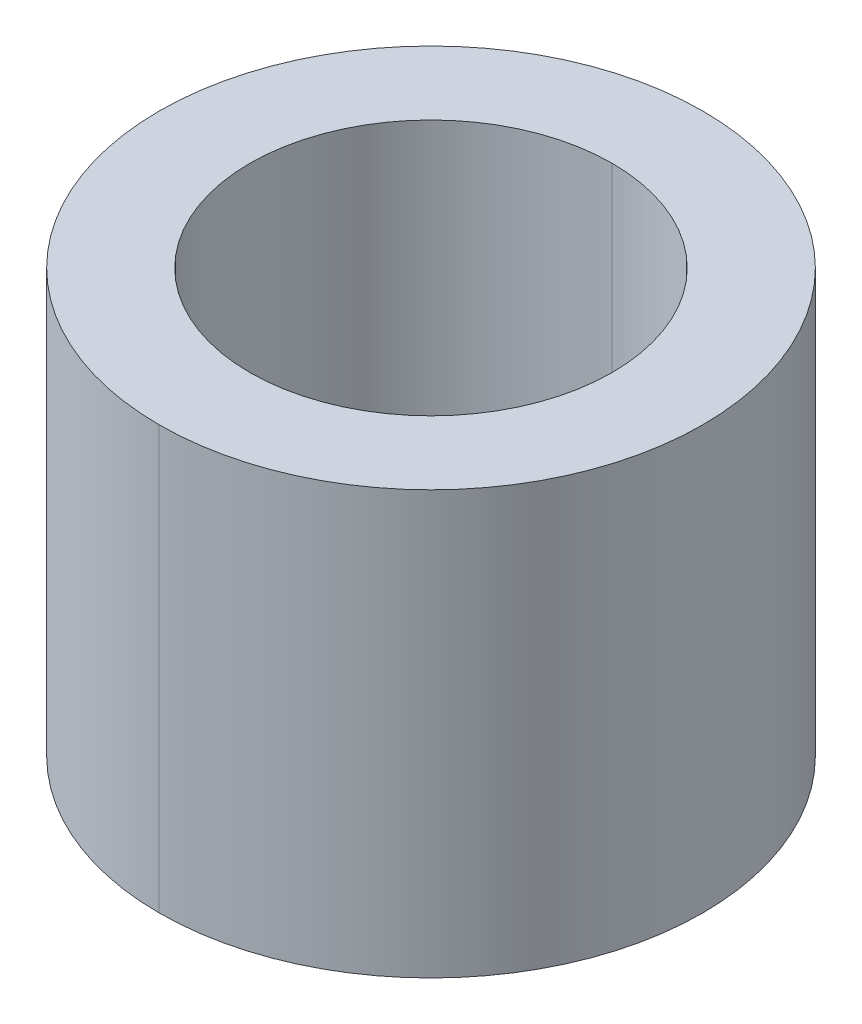
ISO-10303-21;
HEADER;
FILE_DESCRIPTION(('STEP AP214'),'2;1');
FILE_NAME('part.step','',(''),(''),'','','');
FILE_SCHEMA(('AUTOMOTIVE_DESIGN { 1 0 10303 214 1 1 1 1 }'));
ENDSEC;
DATA;
#1=APPLICATION_CONTEXT('core data for automotive mechanical design processes');
#2=APPLICATION_PROTOCOL_DEFINITION('international standard','automotive_design',2000,#1);
#3=PRODUCT_CONTEXT('',#1,'mechanical');
#4=PRODUCT('Part','Part','',(#3));
#5=PRODUCT_RELATED_PRODUCT_CATEGORY('part','',(#4));
#6=PRODUCT_DEFINITION_FORMATION('','',#4);
#7=PRODUCT_DEFINITION_CONTEXT('part definition',#1,'design');
#8=PRODUCT_DEFINITION('design','',#6,#7);
#9=PRODUCT_DEFINITION_SHAPE('','',#8);
#10=(LENGTH_UNIT() NAMED_UNIT(*) SI_UNIT(.MILLI.,.METRE.));
#11=(NAMED_UNIT(*) PLANE_ANGLE_UNIT() SI_UNIT($,.RADIAN.));
#12=(NAMED_UNIT(*) SI_UNIT($,.STERADIAN.) SOLID_ANGLE_UNIT());
#13=UNCERTAINTY_MEASURE_WITH_UNIT(LENGTH_MEASURE(1.E-05),#10,'distance_accuracy_value','');
#14=(GEOMETRIC_REPRESENTATION_CONTEXT(3) GLOBAL_UNCERTAINTY_ASSIGNED_CONTEXT((#13)) GLOBAL_UNIT_ASSIGNED_CONTEXT((#10,
#11,#12)) REPRESENTATION_CONTEXT('',''));
#15=CARTESIAN_POINT('',(0.,0.,0.));
#16=DIRECTION('',(0.,0.,1.));
#17=DIRECTION('',(1.,0.,0.));
#18=AXIS2_PLACEMENT_3D('',#15,#16,#17);
#19=CARTESIAN_POINT('',(0.,7.,0.));
#20=DIRECTION('',(0.,-1.,0.));
#21=DIRECTION('',(0.,0.,-1.));
#22=AXIS2_PLACEMENT_3D('',#19,#20,#21);
#23=CYLINDRICAL_SURFACE('',#22,3.);
#24=DIRECTION('',(0.,-1.,0.));
#25=VECTOR('',#24,1.);
#26=CARTESIAN_POINT('',(0.,7.,3.));
#27=LINE('',#26,#25);
#28=CARTESIAN_POINT('',(0.,7.,3.));
#29=VERTEX_POINT('',#28);
#30=CARTESIAN_POINT('',(0.,0.,3.));
#31=VERTEX_POINT('',#30);
#32=EDGE_CURVE('E78',#29,#31,#27,.T.);
#33=ORIENTED_EDGE('',*,*,#32,.F.);
#34=CARTESIAN_POINT('',(0.,7.,0.));
#35=DIRECTION('',(0.,1.,0.));
#36=DIRECTION('',(0.,0.,1.));
#37=AXIS2_PLACEMENT_3D('',#34,#35,#36);
#38=CIRCLE('',#37,3.);
#39=CARTESIAN_POINT('',(0.,7.,-3.));
#40=VERTEX_POINT('',#39);
#41=EDGE_CURVE('E73',#29,#40,#38,.T.);
#42=ORIENTED_EDGE('',*,*,#41,.T.);
#43=DIRECTION('',(0.,-1.,0.));
#44=VECTOR('',#43,1.);
#45=CARTESIAN_POINT('',(0.,7.,-3.));
#46=LINE('',#45,#44);
#47=CARTESIAN_POINT('',(0.,0.,-3.));
#48=VERTEX_POINT('',#47);
#49=EDGE_CURVE('E75',#40,#48,#46,.T.);
#50=ORIENTED_EDGE('',*,*,#49,.T.);
#51=CARTESIAN_POINT('',(0.,0.,0.));
#52=DIRECTION('',(0.,1.,0.));
#53=DIRECTION('',(0.,0.,1.));
#54=AXIS2_PLACEMENT_3D('',#51,#52,#53);
#55=CIRCLE('',#54,3.);
#56=EDGE_CURVE('E11',#31,#48,#55,.T.);
#57=ORIENTED_EDGE('',*,*,#56,.F.);
#58=EDGE_LOOP('',(#33,#42,#50,#57));
#59=FACE_BOUND('',#58,.T.);
#60=ADVANCED_FACE('F17',(#59),#23,.F.);
#61=CARTESIAN_POINT('',(0.,7.,0.));
#62=DIRECTION('',(0.,-1.,0.));
#63=DIRECTION('',(0.,0.,-1.));
#64=AXIS2_PLACEMENT_3D('',#61,#62,#63);
#65=CYLINDRICAL_SURFACE('',#64,4.5);
#66=DIRECTION('',(0.,-1.,0.));
#67=VECTOR('',#66,1.);
#68=CARTESIAN_POINT('',(0.,7.,4.5));
#69=LINE('',#68,#67);
#70=CARTESIAN_POINT('',(0.,7.,4.5));
#71=VERTEX_POINT('',#70);
#72=CARTESIAN_POINT('',(0.,0.,4.5));
#73=VERTEX_POINT('',#72);
#74=EDGE_CURVE('E111',#71,#73,#69,.T.);
#75=ORIENTED_EDGE('',*,*,#74,.F.);
#76=CARTESIAN_POINT('',(0.,7.,0.));
#77=DIRECTION('',(0.,1.,0.));
#78=DIRECTION('',(0.,0.,1.));
#79=AXIS2_PLACEMENT_3D('',#76,#77,#78);
#80=CIRCLE('',#79,4.5);
#81=CARTESIAN_POINT('',(0.,7.,-4.5));
#82=VERTEX_POINT('',#81);
#83=EDGE_CURVE('E83',#82,#71,#80,.T.);
#84=ORIENTED_EDGE('',*,*,#83,.F.);
#85=DIRECTION('',(0.,-1.,0.));
#86=VECTOR('',#85,1.);
#87=CARTESIAN_POINT('',(0.,7.,-4.5));
#88=LINE('',#87,#86);
#89=CARTESIAN_POINT('',(0.,0.,-4.5));
#90=VERTEX_POINT('',#89);
#91=EDGE_CURVE('E104',#82,#90,#88,.T.);
#92=ORIENTED_EDGE('',*,*,#91,.T.);
#93=CARTESIAN_POINT('',(0.,0.,0.));
#94=DIRECTION('',(0.,1.,0.));
#95=DIRECTION('',(0.,0.,1.));
#96=AXIS2_PLACEMENT_3D('',#93,#94,#95);
#97=CIRCLE('',#96,4.5);
#98=EDGE_CURVE('E21',#90,#73,#97,.T.);
#99=ORIENTED_EDGE('',*,*,#98,.T.);
#100=EDGE_LOOP('',(#75,#84,#92,#99));
#101=FACE_BOUND('',#100,.T.);
#102=ADVANCED_FACE('F19',(#101),#65,.T.);
#103=CARTESIAN_POINT('',(0.,0.,0.));
#104=DIRECTION('',(0.,1.,0.));
#105=DIRECTION('',(1.,0.,0.));
#106=AXIS2_PLACEMENT_3D('',#103,#104,#105);
#107=PLANE('',#106);
#108=CARTESIAN_POINT('',(0.,0.,0.));
#109=DIRECTION('',(0.,1.,0.));
#110=DIRECTION('',(0.,0.,1.));
#111=AXIS2_PLACEMENT_3D('',#108,#109,#110);
#112=CIRCLE('',#111,3.);
#113=EDGE_CURVE('E89',#48,#31,#112,.T.);
#114=ORIENTED_EDGE('',*,*,#113,.T.);
#115=ORIENTED_EDGE('',*,*,#56,.T.);
#116=EDGE_LOOP('',(#114,#115));
#117=FACE_BOUND('',#116,.T.);
#118=ORIENTED_EDGE('',*,*,#98,.F.);
#119=CARTESIAN_POINT('',(0.,0.,0.));
#120=DIRECTION('',(0.,1.,0.));
#121=DIRECTION('',(0.,0.,1.));
#122=AXIS2_PLACEMENT_3D('',#119,#120,#121);
#123=CIRCLE('',#122,4.5);
#124=EDGE_CURVE('E107',#73,#90,#123,.T.);
#125=ORIENTED_EDGE('',*,*,#124,.F.);
#126=EDGE_LOOP('',(#118,#125));
#127=FACE_BOUND('',#126,.T.);
#128=ADVANCED_FACE('F125',(#117,#127),#107,.F.);
#129=CARTESIAN_POINT('',(0.,7.,0.));
#130=DIRECTION('',(0.,1.,0.));
#131=DIRECTION('',(1.,0.,0.));
#132=AXIS2_PLACEMENT_3D('',#129,#130,#131);
#133=PLANE('',#132);
#134=CARTESIAN_POINT('',(0.,7.,0.));
#135=DIRECTION('',(0.,1.,0.));
#136=DIRECTION('',(0.,0.,1.));
#137=AXIS2_PLACEMENT_3D('',#134,#135,#136);
#138=CIRCLE('',#137,3.);
#139=EDGE_CURVE('E87',#40,#29,#138,.T.);
#140=ORIENTED_EDGE('',*,*,#139,.F.);
#141=ORIENTED_EDGE('',*,*,#41,.F.);
#142=EDGE_LOOP('',(#140,#141));
#143=FACE_BOUND('',#142,.T.);
#144=ORIENTED_EDGE('',*,*,#83,.T.);
#145=CARTESIAN_POINT('',(0.,7.,0.));
#146=DIRECTION('',(0.,1.,0.));
#147=DIRECTION('',(0.,0.,1.));
#148=AXIS2_PLACEMENT_3D('',#145,#146,#147);
#149=CIRCLE('',#148,4.5);
#150=EDGE_CURVE('E91',#71,#82,#149,.T.);
#151=ORIENTED_EDGE('',*,*,#150,.T.);
#152=EDGE_LOOP('',(#144,#151));
#153=FACE_BOUND('',#152,.T.);
#154=ADVANCED_FACE('F93',(#143,#153),#133,.T.);
#155=CARTESIAN_POINT('',(0.,7.,0.));
#156=DIRECTION('',(0.,-1.,0.));
#157=DIRECTION('',(0.,0.,-1.));
#158=AXIS2_PLACEMENT_3D('',#155,#156,#157);
#159=CYLINDRICAL_SURFACE('',#158,4.5);
#160=ORIENTED_EDGE('',*,*,#150,.F.);
#161=ORIENTED_EDGE('',*,*,#74,.T.);
#162=ORIENTED_EDGE('',*,*,#124,.T.);
#163=ORIENTED_EDGE('',*,*,#91,.F.);
#164=EDGE_LOOP('',(#160,#161,#162,#163));
#165=FACE_BOUND('',#164,.T.);
#166=ADVANCED_FACE('F124',(#165),#159,.T.);
#167=CARTESIAN_POINT('',(0.,7.,0.));
#168=DIRECTION('',(0.,-1.,0.));
#169=DIRECTION('',(0.,0.,-1.));
#170=AXIS2_PLACEMENT_3D('',#167,#168,#169);
#171=CYLINDRICAL_SURFACE('',#170,3.);
#172=ORIENTED_EDGE('',*,*,#139,.T.);
#173=ORIENTED_EDGE('',*,*,#32,.T.);
#174=ORIENTED_EDGE('',*,*,#113,.F.);
#175=ORIENTED_EDGE('',*,*,#49,.F.);
#176=EDGE_LOOP('',(#172,#173,#174,#175));
#177=FACE_BOUND('',#176,.T.);
#178=ADVANCED_FACE('F86',(#177),#171,.F.);
#179=CLOSED_SHELL('',(#60,#102,#128,#154,#166,#178));
#180=MANIFOLD_SOLID_BREP('B1',#179);
#181=ADVANCED_BREP_SHAPE_REPRESENTATION('',(#18,#180),#14);
#182=SHAPE_DEFINITION_REPRESENTATION(#9,#181);
ENDSEC;
END-ISO-10303-21;
